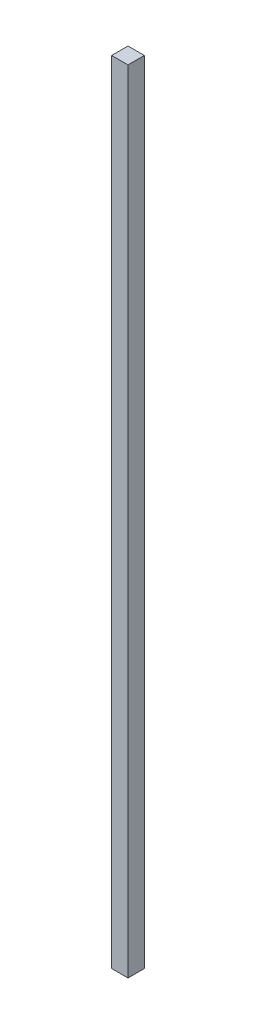
ISO-10303-21;
HEADER;
FILE_DESCRIPTION(('STEP AP214'),'2;1');
FILE_NAME('part.step','',(''),(''),'','','');
FILE_SCHEMA(('AUTOMOTIVE_DESIGN { 1 0 10303 214 1 1 1 1 }'));
ENDSEC;
DATA;
#1=APPLICATION_CONTEXT('core data for automotive mechanical design processes');
#2=APPLICATION_PROTOCOL_DEFINITION('international standard','automotive_design',2000,#1);
#3=PRODUCT_CONTEXT('',#1,'mechanical');
#4=PRODUCT('Part','Part','',(#3));
#5=PRODUCT_RELATED_PRODUCT_CATEGORY('part','',(#4));
#6=PRODUCT_DEFINITION_FORMATION('','',#4);
#7=PRODUCT_DEFINITION_CONTEXT('part definition',#1,'design');
#8=PRODUCT_DEFINITION('design','',#6,#7);
#9=PRODUCT_DEFINITION_SHAPE('','',#8);
#10=(LENGTH_UNIT() NAMED_UNIT(*) SI_UNIT(.MILLI.,.METRE.));
#11=(NAMED_UNIT(*) PLANE_ANGLE_UNIT() SI_UNIT($,.RADIAN.));
#12=(NAMED_UNIT(*) SI_UNIT($,.STERADIAN.) SOLID_ANGLE_UNIT());
#13=UNCERTAINTY_MEASURE_WITH_UNIT(LENGTH_MEASURE(1.E-05),#10,'distance_accuracy_value','');
#14=(GEOMETRIC_REPRESENTATION_CONTEXT(3) GLOBAL_UNCERTAINTY_ASSIGNED_CONTEXT((#13)) GLOBAL_UNIT_ASSIGNED_CONTEXT((#10,
#11,#12)) REPRESENTATION_CONTEXT('',''));
#15=CARTESIAN_POINT('',(0.,0.,0.));
#16=DIRECTION('',(0.,0.,1.));
#17=DIRECTION('',(1.,0.,0.));
#18=AXIS2_PLACEMENT_3D('',#15,#16,#17);
#19=CARTESIAN_POINT('',(0.,10000.,0.));
#20=DIRECTION('',(0.,0.,1.));
#21=DIRECTION('',(1.,0.,0.));
#22=AXIS2_PLACEMENT_3D('',#19,#20,#21);
#23=PLANE('',#22);
#24=DIRECTION('',(-1.,0.,0.));
#25=VECTOR('',#24,1.);
#26=CARTESIAN_POINT('',(0.,0.,0.));
#27=LINE('',#26,#25);
#28=CARTESIAN_POINT('',(207.,0.,0.));
#29=VERTEX_POINT('',#28);
#30=CARTESIAN_POINT('',(0.,0.,0.));
#31=VERTEX_POINT('',#30);
#32=EDGE_CURVE('E131',#29,#31,#27,.T.);
#33=ORIENTED_EDGE('',*,*,#32,.T.);
#34=DIRECTION('',(0.,-1.,0.));
#35=VECTOR('',#34,1.);
#36=CARTESIAN_POINT('',(0.,10000.,0.));
#37=LINE('',#36,#35);
#38=CARTESIAN_POINT('',(0.,10000.,0.));
#39=VERTEX_POINT('',#38);
#40=EDGE_CURVE('E12',#39,#31,#37,.T.);
#41=ORIENTED_EDGE('',*,*,#40,.F.);
#42=DIRECTION('',(-1.,0.,0.));
#43=VECTOR('',#42,1.);
#44=CARTESIAN_POINT('',(0.,10000.,0.));
#45=LINE('',#44,#43);
#46=CARTESIAN_POINT('',(207.,10000.,0.));
#47=VERTEX_POINT('',#46);
#48=EDGE_CURVE('E115',#47,#39,#45,.T.);
#49=ORIENTED_EDGE('',*,*,#48,.F.);
#50=DIRECTION('',(0.,-1.,0.));
#51=VECTOR('',#50,1.);
#52=CARTESIAN_POINT('',(207.,10000.,0.));
#53=LINE('',#52,#51);
#54=EDGE_CURVE('E127',#47,#29,#53,.T.);
#55=ORIENTED_EDGE('',*,*,#54,.T.);
#56=EDGE_LOOP('',(#33,#41,#49,#55));
#57=FACE_BOUND('',#56,.T.);
#58=ADVANCED_FACE('F63',(#57),#23,.F.);
#59=CARTESIAN_POINT('',(0.,10000.,0.));
#60=DIRECTION('',(1.,0.,0.));
#61=DIRECTION('',(0.,0.,-1.));
#62=AXIS2_PLACEMENT_3D('',#59,#60,#61);
#63=PLANE('',#62);
#64=DIRECTION('',(0.,0.,1.));
#65=VECTOR('',#64,1.);
#66=CARTESIAN_POINT('',(0.,0.,0.));
#67=LINE('',#66,#65);
#68=CARTESIAN_POINT('',(0.,0.,207.));
#69=VERTEX_POINT('',#68);
#70=EDGE_CURVE('E120',#31,#69,#67,.T.);
#71=ORIENTED_EDGE('',*,*,#70,.T.);
#72=DIRECTION('',(0.,-1.,0.));
#73=VECTOR('',#72,1.);
#74=CARTESIAN_POINT('',(0.,10000.,207.));
#75=LINE('',#74,#73);
#76=CARTESIAN_POINT('',(0.,10000.,207.));
#77=VERTEX_POINT('',#76);
#78=EDGE_CURVE('E72',#77,#69,#75,.T.);
#79=ORIENTED_EDGE('',*,*,#78,.F.);
#80=DIRECTION('',(0.,0.,1.));
#81=VECTOR('',#80,1.);
#82=CARTESIAN_POINT('',(0.,10000.,0.));
#83=LINE('',#82,#81);
#84=EDGE_CURVE('E110',#39,#77,#83,.T.);
#85=ORIENTED_EDGE('',*,*,#84,.F.);
#86=ORIENTED_EDGE('',*,*,#40,.T.);
#87=EDGE_LOOP('',(#71,#79,#85,#86));
#88=FACE_BOUND('',#87,.T.);
#89=ADVANCED_FACE('F119',(#88),#63,.F.);
#90=CARTESIAN_POINT('',(0.,10000.,207.));
#91=DIRECTION('',(0.,0.,-1.));
#92=DIRECTION('',(-1.,0.,0.));
#93=AXIS2_PLACEMENT_3D('',#90,#91,#92);
#94=PLANE('',#93);
#95=DIRECTION('',(1.,0.,0.));
#96=VECTOR('',#95,1.);
#97=CARTESIAN_POINT('',(0.,0.,207.));
#98=LINE('',#97,#96);
#99=CARTESIAN_POINT('',(207.,0.,207.));
#100=VERTEX_POINT('',#99);
#101=EDGE_CURVE('E97',#69,#100,#98,.T.);
#102=ORIENTED_EDGE('',*,*,#101,.T.);
#103=DIRECTION('',(0.,-1.,0.));
#104=VECTOR('',#103,1.);
#105=CARTESIAN_POINT('',(207.,10000.,207.));
#106=LINE('',#105,#104);
#107=CARTESIAN_POINT('',(207.,10000.,207.));
#108=VERTEX_POINT('',#107);
#109=EDGE_CURVE('E122',#108,#100,#106,.T.);
#110=ORIENTED_EDGE('',*,*,#109,.F.);
#111=DIRECTION('',(1.,0.,0.));
#112=VECTOR('',#111,1.);
#113=CARTESIAN_POINT('',(0.,10000.,207.));
#114=LINE('',#113,#112);
#115=EDGE_CURVE('E113',#77,#108,#114,.T.);
#116=ORIENTED_EDGE('',*,*,#115,.F.);
#117=ORIENTED_EDGE('',*,*,#78,.T.);
#118=EDGE_LOOP('',(#102,#110,#116,#117));
#119=FACE_BOUND('',#118,.T.);
#120=ADVANCED_FACE('F123',(#119),#94,.F.);
#121=CARTESIAN_POINT('',(207.,10000.,0.));
#122=DIRECTION('',(-1.,0.,0.));
#123=DIRECTION('',(0.,0.,1.));
#124=AXIS2_PLACEMENT_3D('',#121,#122,#123);
#125=PLANE('',#124);
#126=DIRECTION('',(0.,0.,-1.));
#127=VECTOR('',#126,1.);
#128=CARTESIAN_POINT('',(207.,0.,0.));
#129=LINE('',#128,#127);
#130=EDGE_CURVE('E103',#100,#29,#129,.T.);
#131=ORIENTED_EDGE('',*,*,#130,.T.);
#132=ORIENTED_EDGE('',*,*,#54,.F.);
#133=DIRECTION('',(0.,0.,-1.));
#134=VECTOR('',#133,1.);
#135=CARTESIAN_POINT('',(207.,10000.,0.));
#136=LINE('',#135,#134);
#137=EDGE_CURVE('E80',#108,#47,#136,.T.);
#138=ORIENTED_EDGE('',*,*,#137,.F.);
#139=ORIENTED_EDGE('',*,*,#109,.T.);
#140=EDGE_LOOP('',(#131,#132,#138,#139));
#141=FACE_BOUND('',#140,.T.);
#142=ADVANCED_FACE('F144',(#141),#125,.F.);
#143=CARTESIAN_POINT('',(0.,10000.,0.));
#144=DIRECTION('',(0.,-1.,0.));
#145=DIRECTION('',(0.,0.,-1.));
#146=AXIS2_PLACEMENT_3D('',#143,#144,#145);
#147=PLANE('',#146);
#148=ORIENTED_EDGE('',*,*,#48,.T.);
#149=ORIENTED_EDGE('',*,*,#84,.T.);
#150=ORIENTED_EDGE('',*,*,#115,.T.);
#151=ORIENTED_EDGE('',*,*,#137,.T.);
#152=EDGE_LOOP('',(#148,#149,#150,#151));
#153=FACE_BOUND('',#152,.T.);
#154=ADVANCED_FACE('F111',(#153),#147,.F.);
#155=CARTESIAN_POINT('',(0.,0.,0.));
#156=DIRECTION('',(0.,-1.,0.));
#157=DIRECTION('',(0.,0.,-1.));
#158=AXIS2_PLACEMENT_3D('',#155,#156,#157);
#159=PLANE('',#158);
#160=ORIENTED_EDGE('',*,*,#32,.F.);
#161=ORIENTED_EDGE('',*,*,#130,.F.);
#162=ORIENTED_EDGE('',*,*,#101,.F.);
#163=ORIENTED_EDGE('',*,*,#70,.F.);
#164=EDGE_LOOP('',(#160,#161,#162,#163));
#165=FACE_BOUND('',#164,.T.);
#166=ADVANCED_FACE('F147',(#165),#159,.T.);
#167=CLOSED_SHELL('',(#58,#89,#120,#142,#154,#166));
#168=MANIFOLD_SOLID_BREP('B2',#167);
#169=ADVANCED_BREP_SHAPE_REPRESENTATION('',(#18,#168),#14);
#170=SHAPE_DEFINITION_REPRESENTATION(#9,#169);
ENDSEC;
END-ISO-10303-21;
